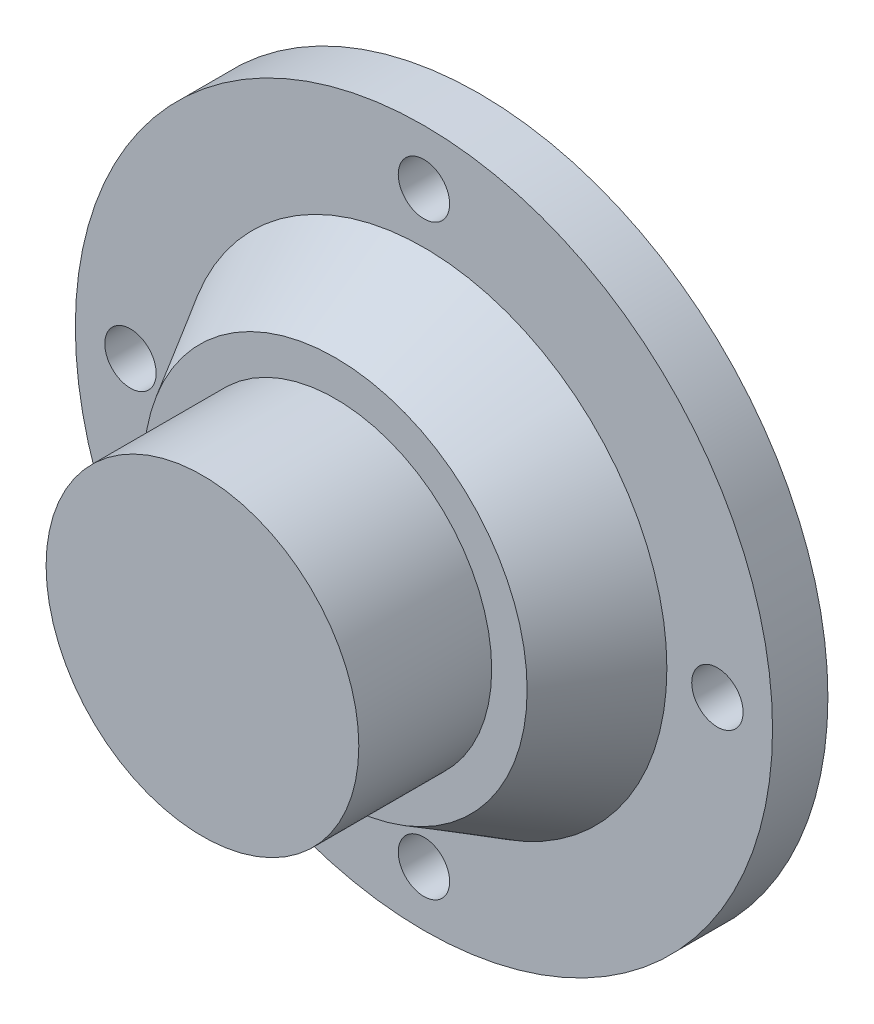
ISO-10303-21;
HEADER;
FILE_DESCRIPTION(('STEP AP214'),'2;1');
FILE_NAME('part.step','',(''),(''),'','','');
FILE_SCHEMA(('AUTOMOTIVE_DESIGN { 1 0 10303 214 1 1 1 1 }'));
ENDSEC;
DATA;
#1=APPLICATION_CONTEXT('core data for automotive mechanical design processes');
#2=APPLICATION_PROTOCOL_DEFINITION('international standard','automotive_design',2000,#1);
#3=PRODUCT_CONTEXT('',#1,'mechanical');
#4=PRODUCT('Part','Part','',(#3));
#5=PRODUCT_RELATED_PRODUCT_CATEGORY('part','',(#4));
#6=PRODUCT_DEFINITION_FORMATION('','',#4);
#7=PRODUCT_DEFINITION_CONTEXT('part definition',#1,'design');
#8=PRODUCT_DEFINITION('design','',#6,#7);
#9=PRODUCT_DEFINITION_SHAPE('','',#8);
#10=(LENGTH_UNIT() NAMED_UNIT(*) SI_UNIT(.MILLI.,.METRE.));
#11=(NAMED_UNIT(*) PLANE_ANGLE_UNIT() SI_UNIT($,.RADIAN.));
#12=(NAMED_UNIT(*) SI_UNIT($,.STERADIAN.) SOLID_ANGLE_UNIT());
#13=UNCERTAINTY_MEASURE_WITH_UNIT(LENGTH_MEASURE(1.E-05),#10,'distance_accuracy_value','');
#14=(GEOMETRIC_REPRESENTATION_CONTEXT(3) GLOBAL_UNCERTAINTY_ASSIGNED_CONTEXT((#13)) GLOBAL_UNIT_ASSIGNED_CONTEXT((#10,
#11,#12)) REPRESENTATION_CONTEXT('',''));
#15=CARTESIAN_POINT('',(0.,0.,0.));
#16=DIRECTION('',(0.,0.,1.));
#17=DIRECTION('',(1.,0.,0.));
#18=AXIS2_PLACEMENT_3D('',#15,#16,#17);
#19=CARTESIAN_POINT('',(0.,0.,0.));
#20=DIRECTION('',(0.,0.,-1.));
#21=DIRECTION('',(-1.,0.,0.));
#22=AXIS2_PLACEMENT_3D('',#19,#20,#21);
#23=PLANE('',#22);
#24=CARTESIAN_POINT('',(0.,0.,0.));
#25=DIRECTION('',(0.,0.,1.));
#26=DIRECTION('',(1.,0.,0.));
#27=AXIS2_PLACEMENT_3D('',#24,#25,#26);
#28=CIRCLE('',#27,8.9662);
#29=CARTESIAN_POINT('',(8.9662,0.,0.));
#30=VERTEX_POINT('',#29);
#31=EDGE_CURVE('E64',#30,#30,#28,.T.);
#32=ORIENTED_EDGE('',*,*,#31,.T.);
#33=EDGE_LOOP('',(#32));
#34=FACE_BOUND('',#33,.T.);
#35=ADVANCED_FACE('F41',(#34),#23,.F.);
#36=CARTESIAN_POINT('',(0.,19.9898,-15.875));
#37=DIRECTION('',(0.,0.,1.));
#38=DIRECTION('',(1.,0.,0.));
#39=AXIS2_PLACEMENT_3D('',#36,#37,#38);
#40=PLANE('',#39);
#41=CARTESIAN_POINT('',(16.8275,0.,-15.875));
#42=DIRECTION('',(0.,0.,-1.));
#43=DIRECTION('',(-1.,0.,0.));
#44=AXIS2_PLACEMENT_3D('',#41,#42,#43);
#45=CIRCLE('',#44,1.47319999999999);
#46=CARTESIAN_POINT('',(15.3543,0.,-15.875));
#47=VERTEX_POINT('',#46);
#48=EDGE_CURVE('E87',#47,#47,#45,.T.);
#49=ORIENTED_EDGE('',*,*,#48,.F.);
#50=EDGE_LOOP('',(#49));
#51=FACE_BOUND('',#50,.T.);
#52=CARTESIAN_POINT('',(-16.8275,0.,-15.875));
#53=DIRECTION('',(0.,0.,-1.));
#54=DIRECTION('',(-1.,0.,0.));
#55=AXIS2_PLACEMENT_3D('',#52,#53,#54);
#56=CIRCLE('',#55,1.47319999999999);
#57=CARTESIAN_POINT('',(-18.3007,0.,-15.875));
#58=VERTEX_POINT('',#57);
#59=EDGE_CURVE('E81',#58,#58,#56,.T.);
#60=ORIENTED_EDGE('',*,*,#59,.F.);
#61=EDGE_LOOP('',(#60));
#62=FACE_BOUND('',#61,.T.);
#63=CARTESIAN_POINT('',(0.,-16.8275,-15.875));
#64=DIRECTION('',(0.,0.,-1.));
#65=DIRECTION('',(-1.,0.,0.));
#66=AXIS2_PLACEMENT_3D('',#63,#64,#65);
#67=CIRCLE('',#66,1.47319999999999);
#68=CARTESIAN_POINT('',(-1.47319999999999,-16.8275,-15.875));
#69=VERTEX_POINT('',#68);
#70=EDGE_CURVE('E73',#69,#69,#67,.T.);
#71=ORIENTED_EDGE('',*,*,#70,.F.);
#72=EDGE_LOOP('',(#71));
#73=FACE_BOUND('',#72,.T.);
#74=CARTESIAN_POINT('',(0.,16.8275,-15.875));
#75=DIRECTION('',(0.,0.,-1.));
#76=DIRECTION('',(-1.,0.,0.));
#77=AXIS2_PLACEMENT_3D('',#74,#75,#76);
#78=CIRCLE('',#77,1.47319999999999);
#79=CARTESIAN_POINT('',(-1.47319999999999,16.8275,-15.875));
#80=VERTEX_POINT('',#79);
#81=EDGE_CURVE('E68',#80,#80,#78,.T.);
#82=ORIENTED_EDGE('',*,*,#81,.F.);
#83=EDGE_LOOP('',(#82));
#84=FACE_BOUND('',#83,.T.);
#85=CARTESIAN_POINT('',(0.,0.,-15.875));
#86=DIRECTION('',(0.,0.,1.));
#87=DIRECTION('',(1.,0.,0.));
#88=AXIS2_PLACEMENT_3D('',#85,#86,#87);
#89=CIRCLE('',#88,19.9898);
#90=CARTESIAN_POINT('',(19.9898,0.,-15.875));
#91=VERTEX_POINT('',#90);
#92=EDGE_CURVE('E10',#91,#91,#89,.T.);
#93=ORIENTED_EDGE('',*,*,#92,.F.);
#94=EDGE_LOOP('',(#93));
#95=FACE_BOUND('',#94,.T.);
#96=ADVANCED_FACE('F94',(#51,#62,#73,#84,#95),#40,.F.);
#97=CARTESIAN_POINT('',(0.,0.,0.));
#98=DIRECTION('',(0.,0.,1.));
#99=DIRECTION('',(1.,0.,0.));
#100=AXIS2_PLACEMENT_3D('',#97,#98,#99);
#101=CYLINDRICAL_SURFACE('',#100,19.9898);
#102=CARTESIAN_POINT('',(0.,0.,-12.7));
#103=DIRECTION('',(0.,0.,1.));
#104=DIRECTION('',(1.,0.,0.));
#105=AXIS2_PLACEMENT_3D('',#102,#103,#104);
#106=CIRCLE('',#105,19.9898);
#107=CARTESIAN_POINT('',(19.9898,0.,-12.7));
#108=VERTEX_POINT('',#107);
#109=EDGE_CURVE('E50',#108,#108,#106,.T.);
#110=ORIENTED_EDGE('',*,*,#109,.F.);
#111=EDGE_LOOP('',(#110));
#112=FACE_BOUND('',#111,.T.);
#113=ORIENTED_EDGE('',*,*,#92,.T.);
#114=EDGE_LOOP('',(#113));
#115=FACE_BOUND('',#114,.T.);
#116=ADVANCED_FACE('F100',(#112,#115),#101,.T.);
#117=CARTESIAN_POINT('',(0.,13.9311393674833,-12.7));
#118=DIRECTION('',(0.,0.,-1.));
#119=DIRECTION('',(-1.,0.,0.));
#120=AXIS2_PLACEMENT_3D('',#117,#118,#119);
#121=PLANE('',#120);
#122=CARTESIAN_POINT('',(16.8275,0.,-12.7));
#123=DIRECTION('',(0.,0.,-1.));
#124=DIRECTION('',(-1.,0.,0.));
#125=AXIS2_PLACEMENT_3D('',#122,#123,#124);
#126=CIRCLE('',#125,1.47319999999999);
#127=CARTESIAN_POINT('',(15.3543,0.,-12.7));
#128=VERTEX_POINT('',#127);
#129=EDGE_CURVE('E83',#128,#128,#126,.T.);
#130=ORIENTED_EDGE('',*,*,#129,.T.);
#131=EDGE_LOOP('',(#130));
#132=FACE_BOUND('',#131,.T.);
#133=CARTESIAN_POINT('',(-16.8275,0.,-12.7));
#134=DIRECTION('',(0.,0.,-1.));
#135=DIRECTION('',(-1.,0.,0.));
#136=AXIS2_PLACEMENT_3D('',#133,#134,#135);
#137=CIRCLE('',#136,1.47319999999999);
#138=CARTESIAN_POINT('',(-18.3007,0.,-12.7));
#139=VERTEX_POINT('',#138);
#140=EDGE_CURVE('E79',#139,#139,#137,.T.);
#141=ORIENTED_EDGE('',*,*,#140,.T.);
#142=EDGE_LOOP('',(#141));
#143=FACE_BOUND('',#142,.T.);
#144=CARTESIAN_POINT('',(0.,-16.8275,-12.7));
#145=DIRECTION('',(0.,0.,-1.));
#146=DIRECTION('',(-1.,0.,0.));
#147=AXIS2_PLACEMENT_3D('',#144,#145,#146);
#148=CIRCLE('',#147,1.47319999999999);
#149=CARTESIAN_POINT('',(-1.47319999999999,-16.8275,-12.7));
#150=VERTEX_POINT('',#149);
#151=EDGE_CURVE('E75',#150,#150,#148,.T.);
#152=ORIENTED_EDGE('',*,*,#151,.T.);
#153=EDGE_LOOP('',(#152));
#154=FACE_BOUND('',#153,.T.);
#155=CARTESIAN_POINT('',(0.,16.8275,-12.7));
#156=DIRECTION('',(0.,0.,-1.));
#157=DIRECTION('',(-1.,0.,0.));
#158=AXIS2_PLACEMENT_3D('',#155,#156,#157);
#159=CIRCLE('',#158,1.47319999999999);
#160=CARTESIAN_POINT('',(-1.47319999999999,16.8275,-12.7));
#161=VERTEX_POINT('',#160);
#162=EDGE_CURVE('E66',#161,#161,#159,.T.);
#163=ORIENTED_EDGE('',*,*,#162,.T.);
#164=EDGE_LOOP('',(#163));
#165=FACE_BOUND('',#164,.T.);
#166=CARTESIAN_POINT('',(0.,0.,-12.7));
#167=DIRECTION('',(0.,0.,1.));
#168=DIRECTION('',(1.,0.,0.));
#169=AXIS2_PLACEMENT_3D('',#166,#167,#168);
#170=CIRCLE('',#169,13.9311393674833);
#171=CARTESIAN_POINT('',(13.9311393674833,0.,-12.7));
#172=VERTEX_POINT('',#171);
#173=EDGE_CURVE('E51',#172,#172,#170,.T.);
#174=ORIENTED_EDGE('',*,*,#173,.F.);
#175=EDGE_LOOP('',(#174));
#176=FACE_BOUND('',#175,.T.);
#177=ORIENTED_EDGE('',*,*,#109,.T.);
#178=EDGE_LOOP('',(#177));
#179=FACE_BOUND('',#178,.T.);
#180=ADVANCED_FACE('F114',(#132,#143,#154,#165,#176,#179),#121,.F.);
#181=CARTESIAN_POINT('',(0.,0.,-12.7));
#182=DIRECTION('',(0.,0.,-1.));
#183=DIRECTION('',(-1.,0.,0.));
#184=AXIS2_PLACEMENT_3D('',#181,#182,#183);
#185=CONICAL_SURFACE('',#184,13.9311393674833,0.523598775598297);
#186=CARTESIAN_POINT('',(0.,0.,-7.62));
#187=DIRECTION('',(0.,0.,1.));
#188=DIRECTION('',(1.,0.,0.));
#189=AXIS2_PLACEMENT_3D('',#186,#187,#188);
#190=CIRCLE('',#189,10.9982);
#191=CARTESIAN_POINT('',(10.9982,0.,-7.62));
#192=VERTEX_POINT('',#191);
#193=EDGE_CURVE('E54',#192,#192,#190,.T.);
#194=ORIENTED_EDGE('',*,*,#193,.F.);
#195=EDGE_LOOP('',(#194));
#196=FACE_BOUND('',#195,.T.);
#197=ORIENTED_EDGE('',*,*,#173,.T.);
#198=EDGE_LOOP('',(#197));
#199=FACE_BOUND('',#198,.T.);
#200=ADVANCED_FACE('F117',(#196,#199),#185,.T.);
#201=CARTESIAN_POINT('',(0.,10.9982,-7.62));
#202=DIRECTION('',(0.,0.,-1.));
#203=DIRECTION('',(-1.,0.,0.));
#204=AXIS2_PLACEMENT_3D('',#201,#202,#203);
#205=PLANE('',#204);
#206=CARTESIAN_POINT('',(0.,0.,-7.62));
#207=DIRECTION('',(0.,0.,1.));
#208=DIRECTION('',(1.,0.,0.));
#209=AXIS2_PLACEMENT_3D('',#206,#207,#208);
#210=CIRCLE('',#209,8.9662);
#211=CARTESIAN_POINT('',(8.9662,0.,-7.62));
#212=VERTEX_POINT('',#211);
#213=EDGE_CURVE('E58',#212,#212,#210,.T.);
#214=ORIENTED_EDGE('',*,*,#213,.F.);
#215=EDGE_LOOP('',(#214));
#216=FACE_BOUND('',#215,.T.);
#217=ORIENTED_EDGE('',*,*,#193,.T.);
#218=EDGE_LOOP('',(#217));
#219=FACE_BOUND('',#218,.T.);
#220=ADVANCED_FACE('F125',(#216,#219),#205,.F.);
#221=CARTESIAN_POINT('',(0.,0.,0.));
#222=DIRECTION('',(0.,0.,1.));
#223=DIRECTION('',(1.,0.,0.));
#224=AXIS2_PLACEMENT_3D('',#221,#222,#223);
#225=CYLINDRICAL_SURFACE('',#224,8.9662);
#226=ORIENTED_EDGE('',*,*,#31,.F.);
#227=EDGE_LOOP('',(#226));
#228=FACE_BOUND('',#227,.T.);
#229=ORIENTED_EDGE('',*,*,#213,.T.);
#230=EDGE_LOOP('',(#229));
#231=FACE_BOUND('',#230,.T.);
#232=ADVANCED_FACE('F108',(#228,#231),#225,.T.);
#233=CARTESIAN_POINT('',(0.,16.8275,-15.875));
#234=DIRECTION('',(0.,0.,-1.));
#235=DIRECTION('',(-1.,0.,0.));
#236=AXIS2_PLACEMENT_3D('',#233,#234,#235);
#237=CYLINDRICAL_SURFACE('',#236,1.47319999999999);
#238=ORIENTED_EDGE('',*,*,#81,.T.);
#239=EDGE_LOOP('',(#238));
#240=FACE_BOUND('',#239,.T.);
#241=ORIENTED_EDGE('',*,*,#162,.F.);
#242=EDGE_LOOP('',(#241));
#243=FACE_BOUND('',#242,.T.);
#244=ADVANCED_FACE('F104',(#240,#243),#237,.F.);
#245=CARTESIAN_POINT('',(0.,-16.8275,-15.875));
#246=DIRECTION('',(0.,0.,-1.));
#247=DIRECTION('',(-1.,0.,0.));
#248=AXIS2_PLACEMENT_3D('',#245,#246,#247);
#249=CYLINDRICAL_SURFACE('',#248,1.47319999999999);
#250=ORIENTED_EDGE('',*,*,#70,.T.);
#251=EDGE_LOOP('',(#250));
#252=FACE_BOUND('',#251,.T.);
#253=ORIENTED_EDGE('',*,*,#151,.F.);
#254=EDGE_LOOP('',(#253));
#255=FACE_BOUND('',#254,.T.);
#256=ADVANCED_FACE('F107',(#252,#255),#249,.F.);
#257=CARTESIAN_POINT('',(-16.8275,0.,-15.875));
#258=DIRECTION('',(0.,0.,-1.));
#259=DIRECTION('',(-1.,0.,0.));
#260=AXIS2_PLACEMENT_3D('',#257,#258,#259);
#261=CYLINDRICAL_SURFACE('',#260,1.47319999999999);
#262=ORIENTED_EDGE('',*,*,#59,.T.);
#263=EDGE_LOOP('',(#262));
#264=FACE_BOUND('',#263,.T.);
#265=ORIENTED_EDGE('',*,*,#140,.F.);
#266=EDGE_LOOP('',(#265));
#267=FACE_BOUND('',#266,.T.);
#268=ADVANCED_FACE('F145',(#264,#267),#261,.F.);
#269=CARTESIAN_POINT('',(16.8275,0.,-15.875));
#270=DIRECTION('',(0.,0.,-1.));
#271=DIRECTION('',(-1.,0.,0.));
#272=AXIS2_PLACEMENT_3D('',#269,#270,#271);
#273=CYLINDRICAL_SURFACE('',#272,1.47319999999999);
#274=ORIENTED_EDGE('',*,*,#48,.T.);
#275=EDGE_LOOP('',(#274));
#276=FACE_BOUND('',#275,.T.);
#277=ORIENTED_EDGE('',*,*,#129,.F.);
#278=EDGE_LOOP('',(#277));
#279=FACE_BOUND('',#278,.T.);
#280=ADVANCED_FACE('F93',(#276,#279),#273,.F.);
#281=CLOSED_SHELL('',(#35,#96,#116,#180,#200,#220,#232,#244,#256,#268,#280));
#282=MANIFOLD_SOLID_BREP('B2',#281);
#283=ADVANCED_BREP_SHAPE_REPRESENTATION('',(#18,#282),#14);
#284=SHAPE_DEFINITION_REPRESENTATION(#9,#283);
ENDSEC;
END-ISO-10303-21;
